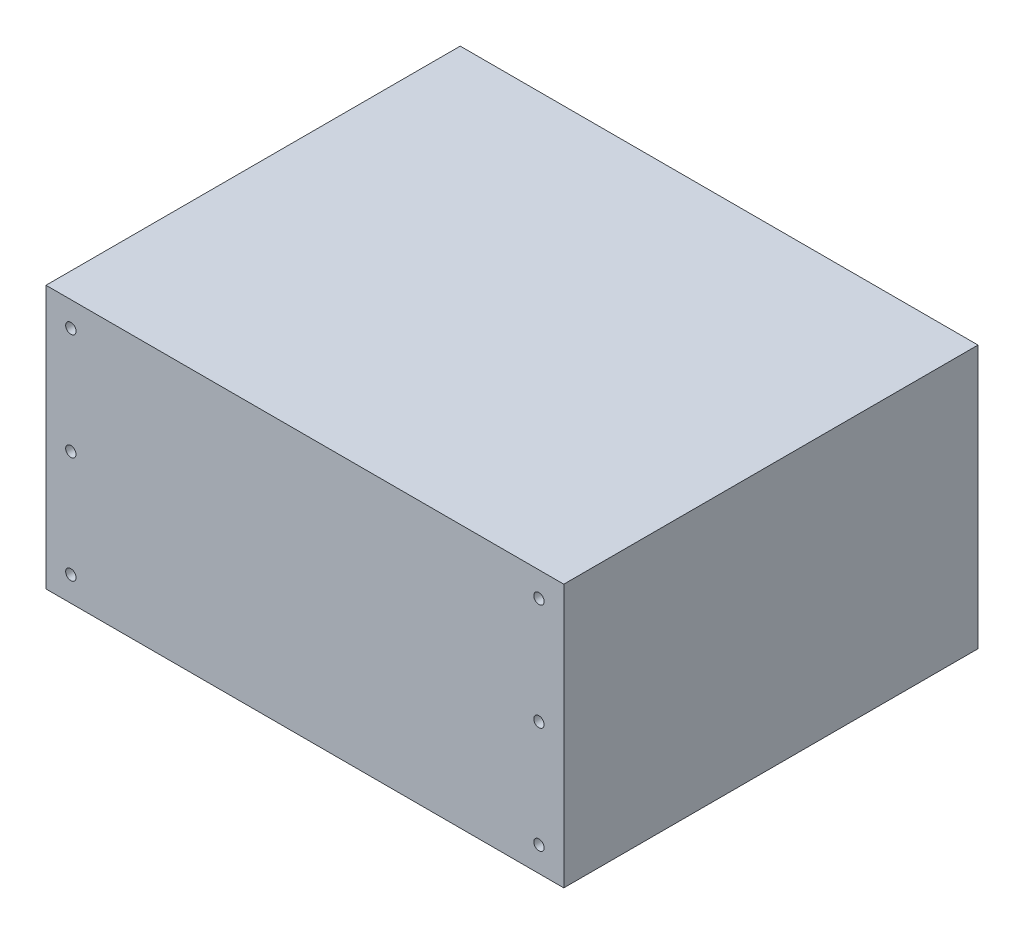
ISO-10303-21;
HEADER;
FILE_DESCRIPTION(('STEP AP214'),'2;1');
FILE_NAME('part.step','',(''),(''),'','','');
FILE_SCHEMA(('AUTOMOTIVE_DESIGN { 1 0 10303 214 1 1 1 1 }'));
ENDSEC;
DATA;
#1=APPLICATION_CONTEXT('core data for automotive mechanical design processes');
#2=APPLICATION_PROTOCOL_DEFINITION('international standard','automotive_design',2000,#1);
#3=PRODUCT_CONTEXT('',#1,'mechanical');
#4=PRODUCT('Part','Part','',(#3));
#5=PRODUCT_RELATED_PRODUCT_CATEGORY('part','',(#4));
#6=PRODUCT_DEFINITION_FORMATION('','',#4);
#7=PRODUCT_DEFINITION_CONTEXT('part definition',#1,'design');
#8=PRODUCT_DEFINITION('design','',#6,#7);
#9=PRODUCT_DEFINITION_SHAPE('','',#8);
#10=(LENGTH_UNIT() NAMED_UNIT(*) SI_UNIT(.MILLI.,.METRE.));
#11=(NAMED_UNIT(*) PLANE_ANGLE_UNIT() SI_UNIT($,.RADIAN.));
#12=(NAMED_UNIT(*) SI_UNIT($,.STERADIAN.) SOLID_ANGLE_UNIT());
#13=UNCERTAINTY_MEASURE_WITH_UNIT(LENGTH_MEASURE(1.E-05),#10,'distance_accuracy_value','');
#14=(GEOMETRIC_REPRESENTATION_CONTEXT(3) GLOBAL_UNCERTAINTY_ASSIGNED_CONTEXT((#13)) GLOBAL_UNIT_ASSIGNED_CONTEXT((#10,
#11,#12)) REPRESENTATION_CONTEXT('',''));
#15=CARTESIAN_POINT('',(0.,0.,0.));
#16=DIRECTION('',(0.,0.,1.));
#17=DIRECTION('',(1.,0.,0.));
#18=AXIS2_PLACEMENT_3D('',#15,#16,#17);
#19=CARTESIAN_POINT('',(0.,0.,100.));
#20=DIRECTION('',(1.,0.,0.));
#21=DIRECTION('',(0.,1.,0.));
#22=AXIS2_PLACEMENT_3D('',#19,#20,#21);
#23=PLANE('',#22);
#24=DIRECTION('',(0.,-1.,0.));
#25=VECTOR('',#24,1.);
#26=CARTESIAN_POINT('',(0.,0.,0.));
#27=LINE('',#26,#25);
#28=CARTESIAN_POINT('',(0.,63.5,0.));
#29=VERTEX_POINT('',#28);
#30=CARTESIAN_POINT('',(0.,0.,0.));
#31=VERTEX_POINT('',#30);
#32=EDGE_CURVE('E154',#29,#31,#27,.T.);
#33=ORIENTED_EDGE('',*,*,#32,.T.);
#34=DIRECTION('',(0.,0.,-1.));
#35=VECTOR('',#34,1.);
#36=CARTESIAN_POINT('',(0.,0.,100.));
#37=LINE('',#36,#35);
#38=CARTESIAN_POINT('',(0.,0.,100.));
#39=VERTEX_POINT('',#38);
#40=EDGE_CURVE('E12',#39,#31,#37,.T.);
#41=ORIENTED_EDGE('',*,*,#40,.F.);
#42=DIRECTION('',(0.,-1.,0.));
#43=VECTOR('',#42,1.);
#44=CARTESIAN_POINT('',(0.,0.,100.));
#45=LINE('',#44,#43);
#46=CARTESIAN_POINT('',(0.,63.5,100.));
#47=VERTEX_POINT('',#46);
#48=EDGE_CURVE('E155',#47,#39,#45,.T.);
#49=ORIENTED_EDGE('',*,*,#48,.F.);
#50=DIRECTION('',(0.,0.,-1.));
#51=VECTOR('',#50,1.);
#52=CARTESIAN_POINT('',(0.,63.5,100.));
#53=LINE('',#52,#51);
#54=EDGE_CURVE('E161',#47,#29,#53,.T.);
#55=ORIENTED_EDGE('',*,*,#54,.T.);
#56=EDGE_LOOP('',(#33,#41,#49,#55));
#57=FACE_BOUND('',#56,.T.);
#58=ADVANCED_FACE('F41',(#57),#23,.F.);
#59=CARTESIAN_POINT('',(0.,0.,100.));
#60=DIRECTION('',(0.,1.,0.));
#61=DIRECTION('',(0.,0.,1.));
#62=AXIS2_PLACEMENT_3D('',#59,#60,#61);
#63=PLANE('',#62);
#64=DIRECTION('',(1.,0.,0.));
#65=VECTOR('',#64,1.);
#66=CARTESIAN_POINT('',(0.,0.,0.));
#67=LINE('',#66,#65);
#68=CARTESIAN_POINT('',(125.,0.,0.));
#69=VERTEX_POINT('',#68);
#70=EDGE_CURVE('E164',#31,#69,#67,.T.);
#71=ORIENTED_EDGE('',*,*,#70,.T.);
#72=DIRECTION('',(0.,0.,-1.));
#73=VECTOR('',#72,1.);
#74=CARTESIAN_POINT('',(125.,0.,100.));
#75=LINE('',#74,#73);
#76=CARTESIAN_POINT('',(125.,0.,100.));
#77=VERTEX_POINT('',#76);
#78=EDGE_CURVE('E51',#77,#69,#75,.T.);
#79=ORIENTED_EDGE('',*,*,#78,.F.);
#80=DIRECTION('',(1.,0.,0.));
#81=VECTOR('',#80,1.);
#82=CARTESIAN_POINT('',(0.,0.,100.));
#83=LINE('',#82,#81);
#84=EDGE_CURVE('E90',#39,#77,#83,.T.);
#85=ORIENTED_EDGE('',*,*,#84,.F.);
#86=ORIENTED_EDGE('',*,*,#40,.T.);
#87=EDGE_LOOP('',(#71,#79,#85,#86));
#88=FACE_BOUND('',#87,.T.);
#89=ADVANCED_FACE('F188',(#88),#63,.F.);
#90=CARTESIAN_POINT('',(125.,0.,100.));
#91=DIRECTION('',(-1.,0.,0.));
#92=DIRECTION('',(0.,-1.,0.));
#93=AXIS2_PLACEMENT_3D('',#90,#91,#92);
#94=PLANE('',#93);
#95=DIRECTION('',(0.,1.,0.));
#96=VECTOR('',#95,1.);
#97=CARTESIAN_POINT('',(125.,0.,0.));
#98=LINE('',#97,#96);
#99=CARTESIAN_POINT('',(125.,63.5,0.));
#100=VERTEX_POINT('',#99);
#101=EDGE_CURVE('E77',#69,#100,#98,.T.);
#102=ORIENTED_EDGE('',*,*,#101,.T.);
#103=DIRECTION('',(0.,0.,-1.));
#104=VECTOR('',#103,1.);
#105=CARTESIAN_POINT('',(125.,63.5,100.));
#106=LINE('',#105,#104);
#107=CARTESIAN_POINT('',(125.,63.5,100.));
#108=VERTEX_POINT('',#107);
#109=EDGE_CURVE('E169',#108,#100,#106,.T.);
#110=ORIENTED_EDGE('',*,*,#109,.F.);
#111=DIRECTION('',(0.,1.,0.));
#112=VECTOR('',#111,1.);
#113=CARTESIAN_POINT('',(125.,0.,100.));
#114=LINE('',#113,#112);
#115=EDGE_CURVE('E158',#77,#108,#114,.T.);
#116=ORIENTED_EDGE('',*,*,#115,.F.);
#117=ORIENTED_EDGE('',*,*,#78,.T.);
#118=EDGE_LOOP('',(#102,#110,#116,#117));
#119=FACE_BOUND('',#118,.T.);
#120=ADVANCED_FACE('F171',(#119),#94,.F.);
#121=CARTESIAN_POINT('',(0.,63.5,100.));
#122=DIRECTION('',(0.,-1.,0.));
#123=DIRECTION('',(0.,0.,-1.));
#124=AXIS2_PLACEMENT_3D('',#121,#122,#123);
#125=PLANE('',#124);
#126=DIRECTION('',(-1.,0.,0.));
#127=VECTOR('',#126,1.);
#128=CARTESIAN_POINT('',(0.,63.5,0.));
#129=LINE('',#128,#127);
#130=EDGE_CURVE('E83',#100,#29,#129,.T.);
#131=ORIENTED_EDGE('',*,*,#130,.T.);
#132=ORIENTED_EDGE('',*,*,#54,.F.);
#133=DIRECTION('',(-1.,0.,0.));
#134=VECTOR('',#133,1.);
#135=CARTESIAN_POINT('',(0.,63.5,100.));
#136=LINE('',#135,#134);
#137=EDGE_CURVE('E59',#108,#47,#136,.T.);
#138=ORIENTED_EDGE('',*,*,#137,.F.);
#139=ORIENTED_EDGE('',*,*,#109,.T.);
#140=EDGE_LOOP('',(#131,#132,#138,#139));
#141=FACE_BOUND('',#140,.T.);
#142=ADVANCED_FACE('F178',(#141),#125,.F.);
#143=CARTESIAN_POINT('',(0.,0.,100.));
#144=DIRECTION('',(0.,0.,-1.));
#145=DIRECTION('',(-1.,0.,0.));
#146=AXIS2_PLACEMENT_3D('',#143,#144,#145);
#147=PLANE('',#146);
#148=CARTESIAN_POINT('',(5.99999999999999,57.5,100.));
#149=DIRECTION('',(0.,0.,1.));
#150=DIRECTION('',(1.,0.,0.));
#151=AXIS2_PLACEMENT_3D('',#148,#149,#150);
#152=CIRCLE('',#151,1.24999999999999);
#153=CARTESIAN_POINT('',(7.24999999999998,57.5,100.));
#154=VERTEX_POINT('',#153);
#155=EDGE_CURVE('E120',#154,#154,#152,.T.);
#156=ORIENTED_EDGE('',*,*,#155,.F.);
#157=EDGE_LOOP('',(#156));
#158=FACE_BOUND('',#157,.T.);
#159=CARTESIAN_POINT('',(119.,57.5,100.));
#160=DIRECTION('',(0.,0.,1.));
#161=DIRECTION('',(1.,0.,0.));
#162=AXIS2_PLACEMENT_3D('',#159,#160,#161);
#163=CIRCLE('',#162,1.24999999999999);
#164=CARTESIAN_POINT('',(120.25,57.5,100.));
#165=VERTEX_POINT('',#164);
#166=EDGE_CURVE('E119',#165,#165,#163,.T.);
#167=ORIENTED_EDGE('',*,*,#166,.F.);
#168=EDGE_LOOP('',(#167));
#169=FACE_BOUND('',#168,.T.);
#170=CARTESIAN_POINT('',(119.,6.,100.));
#171=DIRECTION('',(0.,0.,1.));
#172=DIRECTION('',(1.,0.,0.));
#173=AXIS2_PLACEMENT_3D('',#170,#171,#172);
#174=CIRCLE('',#173,1.24999999999999);
#175=CARTESIAN_POINT('',(120.25,6.,100.));
#176=VERTEX_POINT('',#175);
#177=EDGE_CURVE('E130',#176,#176,#174,.T.);
#178=ORIENTED_EDGE('',*,*,#177,.F.);
#179=EDGE_LOOP('',(#178));
#180=FACE_BOUND('',#179,.T.);
#181=CARTESIAN_POINT('',(5.99999999999999,6.,100.));
#182=DIRECTION('',(0.,0.,1.));
#183=DIRECTION('',(1.,0.,0.));
#184=AXIS2_PLACEMENT_3D('',#181,#182,#183);
#185=CIRCLE('',#184,1.24999999999999);
#186=CARTESIAN_POINT('',(7.24999999999998,6.,100.));
#187=VERTEX_POINT('',#186);
#188=EDGE_CURVE('E136',#187,#187,#185,.T.);
#189=ORIENTED_EDGE('',*,*,#188,.F.);
#190=EDGE_LOOP('',(#189));
#191=FACE_BOUND('',#190,.T.);
#192=CARTESIAN_POINT('',(119.,31.7500000000001,100.));
#193=DIRECTION('',(0.,0.,1.));
#194=DIRECTION('',(1.,0.,0.));
#195=AXIS2_PLACEMENT_3D('',#192,#193,#194);
#196=CIRCLE('',#195,1.24999999999999);
#197=CARTESIAN_POINT('',(120.25,31.7500000000001,100.));
#198=VERTEX_POINT('',#197);
#199=EDGE_CURVE('E142',#198,#198,#196,.T.);
#200=ORIENTED_EDGE('',*,*,#199,.F.);
#201=EDGE_LOOP('',(#200));
#202=FACE_BOUND('',#201,.T.);
#203=CARTESIAN_POINT('',(5.99999999999999,31.7500000000001,100.));
#204=DIRECTION('',(0.,0.,1.));
#205=DIRECTION('',(1.,0.,0.));
#206=AXIS2_PLACEMENT_3D('',#203,#204,#205);
#207=CIRCLE('',#206,1.24999999999999);
#208=CARTESIAN_POINT('',(7.24999999999998,31.7500000000001,100.));
#209=VERTEX_POINT('',#208);
#210=EDGE_CURVE('E148',#209,#209,#207,.T.);
#211=ORIENTED_EDGE('',*,*,#210,.F.);
#212=EDGE_LOOP('',(#211));
#213=FACE_BOUND('',#212,.T.);
#214=ORIENTED_EDGE('',*,*,#48,.T.);
#215=ORIENTED_EDGE('',*,*,#84,.T.);
#216=ORIENTED_EDGE('',*,*,#115,.T.);
#217=ORIENTED_EDGE('',*,*,#137,.T.);
#218=EDGE_LOOP('',(#214,#215,#216,#217));
#219=FACE_BOUND('',#218,.T.);
#220=ADVANCED_FACE('F180',(#158,#169,#180,#191,#202,#213,#219),#147,.F.);
#221=CARTESIAN_POINT('',(0.,0.,0.));
#222=DIRECTION('',(0.,0.,-1.));
#223=DIRECTION('',(-1.,0.,0.));
#224=AXIS2_PLACEMENT_3D('',#221,#222,#223);
#225=PLANE('',#224);
#226=ORIENTED_EDGE('',*,*,#32,.F.);
#227=ORIENTED_EDGE('',*,*,#130,.F.);
#228=ORIENTED_EDGE('',*,*,#101,.F.);
#229=ORIENTED_EDGE('',*,*,#70,.F.);
#230=EDGE_LOOP('',(#226,#227,#228,#229));
#231=FACE_BOUND('',#230,.T.);
#232=ADVANCED_FACE('F174',(#231),#225,.T.);
#233=CARTESIAN_POINT('',(5.99999999999999,31.7500000000001,95.));
#234=DIRECTION('',(0.,0.,1.));
#235=DIRECTION('',(1.,0.,0.));
#236=AXIS2_PLACEMENT_3D('',#233,#234,#235);
#237=CONICAL_SURFACE('',#236,1.24999999999999,1.02974425867665);
#238=CARTESIAN_POINT('',(5.99999999999999,31.7500000000001,94.2489242262156));
#239=VERTEX_POINT('',#238);
#240=VERTEX_LOOP('',#239);
#241=FACE_BOUND('',#240,.T.);
#242=CARTESIAN_POINT('',(5.99999999999999,31.7500000000001,95.));
#243=DIRECTION('',(0.,0.,1.));
#244=DIRECTION('',(1.,0.,0.));
#245=AXIS2_PLACEMENT_3D('',#242,#243,#244);
#246=CIRCLE('',#245,1.24999999999999);
#247=CARTESIAN_POINT('',(7.24999999999998,31.7500000000001,95.));
#248=VERTEX_POINT('',#247);
#249=EDGE_CURVE('E151',#248,#248,#246,.T.);
#250=ORIENTED_EDGE('',*,*,#249,.T.);
#251=EDGE_LOOP('',(#250));
#252=FACE_BOUND('',#251,.T.);
#253=ADVANCED_FACE('F215',(#241,#252),#237,.F.);
#254=CARTESIAN_POINT('',(5.99999999999999,31.7500000000001,100.));
#255=DIRECTION('',(0.,0.,1.));
#256=DIRECTION('',(1.,0.,0.));
#257=AXIS2_PLACEMENT_3D('',#254,#255,#256);
#258=CYLINDRICAL_SURFACE('',#257,1.24999999999999);
#259=ORIENTED_EDGE('',*,*,#249,.F.);
#260=EDGE_LOOP('',(#259));
#261=FACE_BOUND('',#260,.T.);
#262=ORIENTED_EDGE('',*,*,#210,.T.);
#263=EDGE_LOOP('',(#262));
#264=FACE_BOUND('',#263,.T.);
#265=ADVANCED_FACE('F228',(#261,#264),#258,.F.);
#266=CARTESIAN_POINT('',(119.,31.7500000000001,95.));
#267=DIRECTION('',(0.,0.,1.));
#268=DIRECTION('',(1.,0.,0.));
#269=AXIS2_PLACEMENT_3D('',#266,#267,#268);
#270=CONICAL_SURFACE('',#269,1.24999999999999,1.02974425867665);
#271=CARTESIAN_POINT('',(119.,31.7500000000001,94.2489242262156));
#272=VERTEX_POINT('',#271);
#273=VERTEX_LOOP('',#272);
#274=FACE_BOUND('',#273,.T.);
#275=CARTESIAN_POINT('',(119.,31.7500000000001,95.));
#276=DIRECTION('',(0.,0.,1.));
#277=DIRECTION('',(1.,0.,0.));
#278=AXIS2_PLACEMENT_3D('',#275,#276,#277);
#279=CIRCLE('',#278,1.24999999999999);
#280=CARTESIAN_POINT('',(120.25,31.7500000000001,95.));
#281=VERTEX_POINT('',#280);
#282=EDGE_CURVE('E145',#281,#281,#279,.T.);
#283=ORIENTED_EDGE('',*,*,#282,.T.);
#284=EDGE_LOOP('',(#283));
#285=FACE_BOUND('',#284,.T.);
#286=ADVANCED_FACE('F238',(#274,#285),#270,.F.);
#287=CARTESIAN_POINT('',(119.,31.7500000000001,100.));
#288=DIRECTION('',(0.,0.,1.));
#289=DIRECTION('',(1.,0.,0.));
#290=AXIS2_PLACEMENT_3D('',#287,#288,#289);
#291=CYLINDRICAL_SURFACE('',#290,1.24999999999999);
#292=ORIENTED_EDGE('',*,*,#282,.F.);
#293=EDGE_LOOP('',(#292));
#294=FACE_BOUND('',#293,.T.);
#295=ORIENTED_EDGE('',*,*,#199,.T.);
#296=EDGE_LOOP('',(#295));
#297=FACE_BOUND('',#296,.T.);
#298=ADVANCED_FACE('F248',(#294,#297),#291,.F.);
#299=CARTESIAN_POINT('',(5.99999999999999,6.,95.));
#300=DIRECTION('',(0.,0.,1.));
#301=DIRECTION('',(1.,0.,0.));
#302=AXIS2_PLACEMENT_3D('',#299,#300,#301);
#303=CONICAL_SURFACE('',#302,1.24999999999999,1.02974425867665);
#304=CARTESIAN_POINT('',(5.99999999999999,6.,94.2489242262156));
#305=VERTEX_POINT('',#304);
#306=VERTEX_LOOP('',#305);
#307=FACE_BOUND('',#306,.T.);
#308=CARTESIAN_POINT('',(5.99999999999999,6.,95.));
#309=DIRECTION('',(0.,0.,1.));
#310=DIRECTION('',(1.,0.,0.));
#311=AXIS2_PLACEMENT_3D('',#308,#309,#310);
#312=CIRCLE('',#311,1.24999999999999);
#313=CARTESIAN_POINT('',(7.24999999999998,6.,95.));
#314=VERTEX_POINT('',#313);
#315=EDGE_CURVE('E139',#314,#314,#312,.T.);
#316=ORIENTED_EDGE('',*,*,#315,.T.);
#317=EDGE_LOOP('',(#316));
#318=FACE_BOUND('',#317,.T.);
#319=ADVANCED_FACE('F258',(#307,#318),#303,.F.);
#320=CARTESIAN_POINT('',(5.99999999999999,6.,100.));
#321=DIRECTION('',(0.,0.,1.));
#322=DIRECTION('',(1.,0.,0.));
#323=AXIS2_PLACEMENT_3D('',#320,#321,#322);
#324=CYLINDRICAL_SURFACE('',#323,1.24999999999999);
#325=ORIENTED_EDGE('',*,*,#315,.F.);
#326=EDGE_LOOP('',(#325));
#327=FACE_BOUND('',#326,.T.);
#328=ORIENTED_EDGE('',*,*,#188,.T.);
#329=EDGE_LOOP('',(#328));
#330=FACE_BOUND('',#329,.T.);
#331=ADVANCED_FACE('F268',(#327,#330),#324,.F.);
#332=CARTESIAN_POINT('',(119.,6.,95.));
#333=DIRECTION('',(0.,0.,1.));
#334=DIRECTION('',(1.,0.,0.));
#335=AXIS2_PLACEMENT_3D('',#332,#333,#334);
#336=CONICAL_SURFACE('',#335,1.24999999999999,1.02974425867665);
#337=CARTESIAN_POINT('',(119.,6.,94.2489242262156));
#338=VERTEX_POINT('',#337);
#339=VERTEX_LOOP('',#338);
#340=FACE_BOUND('',#339,.T.);
#341=CARTESIAN_POINT('',(119.,6.,95.));
#342=DIRECTION('',(0.,0.,1.));
#343=DIRECTION('',(1.,0.,0.));
#344=AXIS2_PLACEMENT_3D('',#341,#342,#343);
#345=CIRCLE('',#344,1.24999999999999);
#346=CARTESIAN_POINT('',(120.25,6.,95.));
#347=VERTEX_POINT('',#346);
#348=EDGE_CURVE('E133',#347,#347,#345,.T.);
#349=ORIENTED_EDGE('',*,*,#348,.T.);
#350=EDGE_LOOP('',(#349));
#351=FACE_BOUND('',#350,.T.);
#352=ADVANCED_FACE('F278',(#340,#351),#336,.F.);
#353=CARTESIAN_POINT('',(119.,6.,100.));
#354=DIRECTION('',(0.,0.,1.));
#355=DIRECTION('',(1.,0.,0.));
#356=AXIS2_PLACEMENT_3D('',#353,#354,#355);
#357=CYLINDRICAL_SURFACE('',#356,1.24999999999999);
#358=ORIENTED_EDGE('',*,*,#348,.F.);
#359=EDGE_LOOP('',(#358));
#360=FACE_BOUND('',#359,.T.);
#361=ORIENTED_EDGE('',*,*,#177,.T.);
#362=EDGE_LOOP('',(#361));
#363=FACE_BOUND('',#362,.T.);
#364=ADVANCED_FACE('F288',(#360,#363),#357,.F.);
#365=CARTESIAN_POINT('',(119.,57.5,95.));
#366=DIRECTION('',(0.,0.,1.));
#367=DIRECTION('',(1.,0.,0.));
#368=AXIS2_PLACEMENT_3D('',#365,#366,#367);
#369=CONICAL_SURFACE('',#368,1.24999999999999,1.02974425867665);
#370=CARTESIAN_POINT('',(119.,57.5,94.2489242262156));
#371=VERTEX_POINT('',#370);
#372=VERTEX_LOOP('',#371);
#373=FACE_BOUND('',#372,.T.);
#374=CARTESIAN_POINT('',(119.,57.5,95.));
#375=DIRECTION('',(0.,0.,1.));
#376=DIRECTION('',(1.,0.,0.));
#377=AXIS2_PLACEMENT_3D('',#374,#375,#376);
#378=CIRCLE('',#377,1.24999999999999);
#379=CARTESIAN_POINT('',(120.25,57.5,95.));
#380=VERTEX_POINT('',#379);
#381=EDGE_CURVE('E123',#380,#380,#378,.T.);
#382=ORIENTED_EDGE('',*,*,#381,.T.);
#383=EDGE_LOOP('',(#382));
#384=FACE_BOUND('',#383,.T.);
#385=ADVANCED_FACE('F298',(#373,#384),#369,.F.);
#386=CARTESIAN_POINT('',(119.,57.5,100.));
#387=DIRECTION('',(0.,0.,1.));
#388=DIRECTION('',(1.,0.,0.));
#389=AXIS2_PLACEMENT_3D('',#386,#387,#388);
#390=CYLINDRICAL_SURFACE('',#389,1.24999999999999);
#391=ORIENTED_EDGE('',*,*,#381,.F.);
#392=EDGE_LOOP('',(#391));
#393=FACE_BOUND('',#392,.T.);
#394=ORIENTED_EDGE('',*,*,#166,.T.);
#395=EDGE_LOOP('',(#394));
#396=FACE_BOUND('',#395,.T.);
#397=ADVANCED_FACE('F113',(#393,#396),#390,.F.);
#398=CARTESIAN_POINT('',(5.99999999999999,57.5,95.));
#399=DIRECTION('',(0.,0.,1.));
#400=DIRECTION('',(1.,0.,0.));
#401=AXIS2_PLACEMENT_3D('',#398,#399,#400);
#402=CONICAL_SURFACE('',#401,1.24999999999999,1.02974425867665);
#403=CARTESIAN_POINT('',(5.99999999999999,57.5,94.2489242262156));
#404=VERTEX_POINT('',#403);
#405=VERTEX_LOOP('',#404);
#406=FACE_BOUND('',#405,.T.);
#407=CARTESIAN_POINT('',(5.99999999999999,57.5,95.));
#408=DIRECTION('',(0.,0.,1.));
#409=DIRECTION('',(1.,0.,0.));
#410=AXIS2_PLACEMENT_3D('',#407,#408,#409);
#411=CIRCLE('',#410,1.24999999999999);
#412=CARTESIAN_POINT('',(7.24999999999998,57.5,95.));
#413=VERTEX_POINT('',#412);
#414=EDGE_CURVE('E117',#413,#413,#411,.T.);
#415=ORIENTED_EDGE('',*,*,#414,.T.);
#416=EDGE_LOOP('',(#415));
#417=FACE_BOUND('',#416,.T.);
#418=ADVANCED_FACE('F109',(#406,#417),#402,.F.);
#419=CARTESIAN_POINT('',(5.99999999999999,57.5,100.));
#420=DIRECTION('',(0.,0.,1.));
#421=DIRECTION('',(1.,0.,0.));
#422=AXIS2_PLACEMENT_3D('',#419,#420,#421);
#423=CYLINDRICAL_SURFACE('',#422,1.24999999999999);
#424=ORIENTED_EDGE('',*,*,#414,.F.);
#425=EDGE_LOOP('',(#424));
#426=FACE_BOUND('',#425,.T.);
#427=ORIENTED_EDGE('',*,*,#155,.T.);
#428=EDGE_LOOP('',(#427));
#429=FACE_BOUND('',#428,.T.);
#430=ADVANCED_FACE('F112',(#426,#429),#423,.F.);
#431=CLOSED_SHELL('',(#58,#89,#120,#142,#220,#232,#253,#265,#286,#298,#319,#331,#352,#364,#385,
#397,#418,#430));
#432=MANIFOLD_SOLID_BREP('B2',#431);
#433=ADVANCED_BREP_SHAPE_REPRESENTATION('',(#18,#432),#14);
#434=SHAPE_DEFINITION_REPRESENTATION(#9,#433);
ENDSEC;
END-ISO-10303-21;
